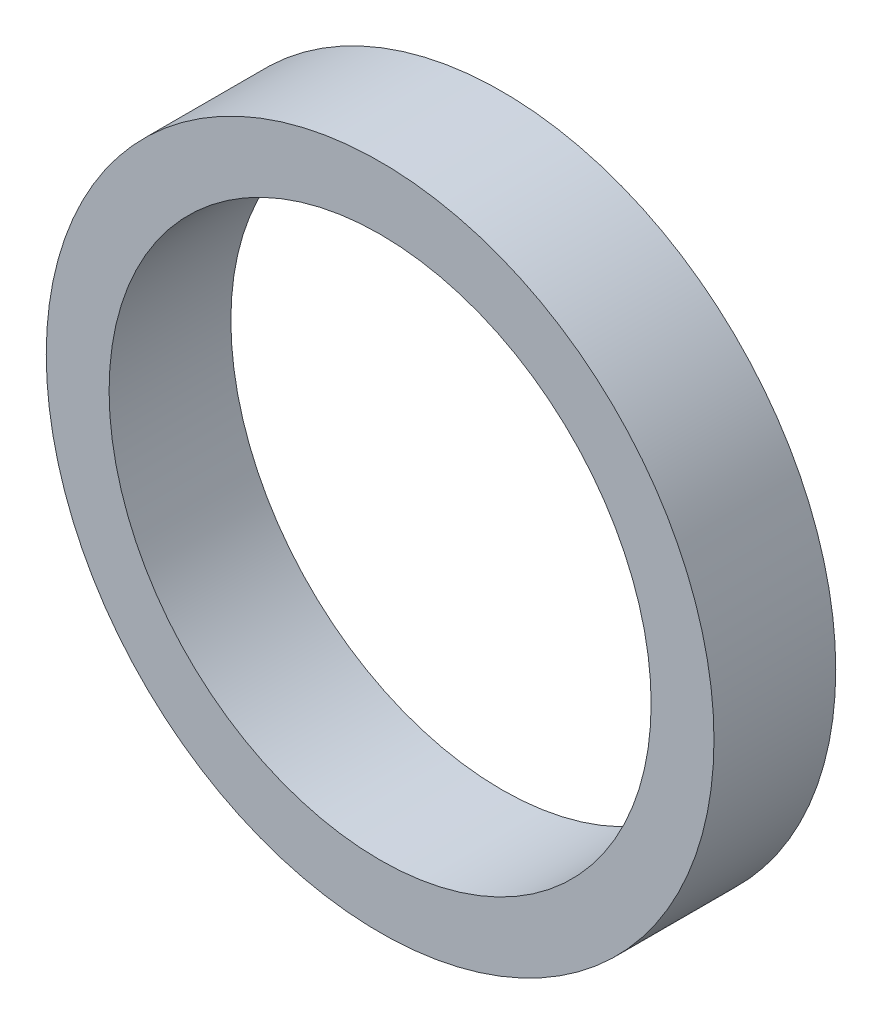
ISO-10303-21;
HEADER;
FILE_DESCRIPTION(('STEP AP214'),'2;1');
FILE_NAME('part.step','',(''),(''),'','','');
FILE_SCHEMA(('AUTOMOTIVE_DESIGN { 1 0 10303 214 1 1 1 1 }'));
ENDSEC;
DATA;
#1=APPLICATION_CONTEXT('core data for automotive mechanical design processes');
#2=APPLICATION_PROTOCOL_DEFINITION('international standard','automotive_design',2000,#1);
#3=PRODUCT_CONTEXT('',#1,'mechanical');
#4=PRODUCT('Part','Part','',(#3));
#5=PRODUCT_RELATED_PRODUCT_CATEGORY('part','',(#4));
#6=PRODUCT_DEFINITION_FORMATION('','',#4);
#7=PRODUCT_DEFINITION_CONTEXT('part definition',#1,'design');
#8=PRODUCT_DEFINITION('design','',#6,#7);
#9=PRODUCT_DEFINITION_SHAPE('','',#8);
#10=(LENGTH_UNIT() NAMED_UNIT(*) SI_UNIT(.MILLI.,.METRE.));
#11=(NAMED_UNIT(*) PLANE_ANGLE_UNIT() SI_UNIT($,.RADIAN.));
#12=(NAMED_UNIT(*) SI_UNIT($,.STERADIAN.) SOLID_ANGLE_UNIT());
#13=UNCERTAINTY_MEASURE_WITH_UNIT(LENGTH_MEASURE(1.E-05),#10,'distance_accuracy_value','');
#14=(GEOMETRIC_REPRESENTATION_CONTEXT(3) GLOBAL_UNCERTAINTY_ASSIGNED_CONTEXT((#13)) GLOBAL_UNIT_ASSIGNED_CONTEXT((#10,
#11,#12)) REPRESENTATION_CONTEXT('',''));
#15=CARTESIAN_POINT('',(0.,0.,0.));
#16=DIRECTION('',(0.,0.,1.));
#17=DIRECTION('',(1.,0.,0.));
#18=AXIS2_PLACEMENT_3D('',#15,#16,#17);
#19=CARTESIAN_POINT('',(0.,0.,6.2));
#20=DIRECTION('',(0.,0.,1.));
#21=DIRECTION('',(1.,0.,0.));
#22=AXIS2_PLACEMENT_3D('',#19,#20,#21);
#23=PLANE('',#22);
#24=CARTESIAN_POINT('',(0.,0.,6.2));
#25=DIRECTION('',(0.,0.,1.));
#26=DIRECTION('',(1.,0.,0.));
#27=AXIS2_PLACEMENT_3D('',#24,#25,#26);
#28=CIRCLE('',#27,17.);
#29=CARTESIAN_POINT('',(-17.,0.,6.2));
#30=VERTEX_POINT('',#29);
#31=EDGE_CURVE('E10',#30,#30,#28,.T.);
#32=ORIENTED_EDGE('',*,*,#31,.T.);
#33=EDGE_LOOP('',(#32));
#34=FACE_BOUND('',#33,.T.);
#35=CARTESIAN_POINT('',(0.,0.,6.2));
#36=DIRECTION('',(0.,0.,1.));
#37=DIRECTION('',(1.,0.,0.));
#38=AXIS2_PLACEMENT_3D('',#35,#36,#37);
#39=CIRCLE('',#38,13.8);
#40=CARTESIAN_POINT('',(-13.8,0.,6.2));
#41=VERTEX_POINT('',#40);
#42=EDGE_CURVE('E42',#41,#41,#39,.T.);
#43=ORIENTED_EDGE('',*,*,#42,.F.);
#44=EDGE_LOOP('',(#43));
#45=FACE_BOUND('',#44,.T.);
#46=ADVANCED_FACE('F31',(#34,#45),#23,.T.);
#47=CARTESIAN_POINT('',(0.,0.,0.));
#48=DIRECTION('',(0.,0.,1.));
#49=DIRECTION('',(1.,0.,0.));
#50=AXIS2_PLACEMENT_3D('',#47,#48,#49);
#51=PLANE('',#50);
#52=CARTESIAN_POINT('',(0.,0.,0.));
#53=DIRECTION('',(0.,0.,1.));
#54=DIRECTION('',(1.,0.,0.));
#55=AXIS2_PLACEMENT_3D('',#52,#53,#54);
#56=CIRCLE('',#55,17.);
#57=CARTESIAN_POINT('',(-17.,0.,0.));
#58=VERTEX_POINT('',#57);
#59=EDGE_CURVE('E35',#58,#58,#56,.T.);
#60=ORIENTED_EDGE('',*,*,#59,.F.);
#61=EDGE_LOOP('',(#60));
#62=FACE_BOUND('',#61,.T.);
#63=CARTESIAN_POINT('',(0.,0.,0.));
#64=DIRECTION('',(0.,0.,1.));
#65=DIRECTION('',(1.,0.,0.));
#66=AXIS2_PLACEMENT_3D('',#63,#64,#65);
#67=CIRCLE('',#66,13.8);
#68=CARTESIAN_POINT('',(-13.8,0.,0.));
#69=VERTEX_POINT('',#68);
#70=EDGE_CURVE('E44',#69,#69,#67,.T.);
#71=ORIENTED_EDGE('',*,*,#70,.T.);
#72=EDGE_LOOP('',(#71));
#73=FACE_BOUND('',#72,.T.);
#74=ADVANCED_FACE('F54',(#62,#73),#51,.F.);
#75=CARTESIAN_POINT('',(0.,0.,6.2));
#76=DIRECTION('',(0.,0.,-1.));
#77=DIRECTION('',(-1.,0.,0.));
#78=AXIS2_PLACEMENT_3D('',#75,#76,#77);
#79=CYLINDRICAL_SURFACE('',#78,17.);
#80=CARTESIAN_POINT('',(-17.,0.,6.2));
#81=CARTESIAN_POINT('',(-17.,0.,6.13541666666667));
#82=CARTESIAN_POINT('',(-17.,0.,6.07083333333333));
#83=CARTESIAN_POINT('',(-17.,0.,5.94166666666667));
#84=CARTESIAN_POINT('',(-17.,0.,5.87708333333333));
#85=CARTESIAN_POINT('',(-17.,0.,5.74791666666667));
#86=CARTESIAN_POINT('',(-17.,0.,5.68333333333333));
#87=CARTESIAN_POINT('',(-17.,0.,5.55416666666667));
#88=CARTESIAN_POINT('',(-17.,0.,5.48958333333333));
#89=CARTESIAN_POINT('',(-17.,0.,5.36041666666667));
#90=CARTESIAN_POINT('',(-17.,0.,5.29583333333333));
#91=CARTESIAN_POINT('',(-17.,0.,5.16666666666667));
#92=CARTESIAN_POINT('',(-17.,0.,5.10208333333333));
#93=CARTESIAN_POINT('',(-17.,0.,4.97291666666667));
#94=CARTESIAN_POINT('',(-17.,0.,4.90833333333333));
#95=CARTESIAN_POINT('',(-17.,0.,4.77916666666667));
#96=CARTESIAN_POINT('',(-17.,0.,4.71458333333333));
#97=CARTESIAN_POINT('',(-17.,0.,4.58541666666667));
#98=CARTESIAN_POINT('',(-17.,0.,4.52083333333333));
#99=CARTESIAN_POINT('',(-17.,0.,4.39166666666667));
#100=CARTESIAN_POINT('',(-17.,0.,4.32708333333333));
#101=CARTESIAN_POINT('',(-17.,0.,4.19791666666667));
#102=CARTESIAN_POINT('',(-17.,0.,4.13333333333333));
#103=CARTESIAN_POINT('',(-17.,0.,4.00416666666667));
#104=CARTESIAN_POINT('',(-17.,0.,3.93958333333333));
#105=CARTESIAN_POINT('',(-17.,0.,3.81041666666667));
#106=CARTESIAN_POINT('',(-17.,0.,3.74583333333333));
#107=CARTESIAN_POINT('',(-17.,0.,3.61666666666667));
#108=CARTESIAN_POINT('',(-17.,0.,3.55208333333333));
#109=CARTESIAN_POINT('',(-17.,0.,3.42291666666667));
#110=CARTESIAN_POINT('',(-17.,0.,3.35833333333333));
#111=CARTESIAN_POINT('',(-17.,0.,3.22916666666667));
#112=CARTESIAN_POINT('',(-17.,0.,3.16458333333333));
#113=CARTESIAN_POINT('',(-17.,0.,3.03541666666667));
#114=CARTESIAN_POINT('',(-17.,0.,2.97083333333333));
#115=CARTESIAN_POINT('',(-17.,0.,2.84166666666667));
#116=CARTESIAN_POINT('',(-17.,0.,2.77708333333333));
#117=CARTESIAN_POINT('',(-17.,0.,2.64791666666667));
#118=CARTESIAN_POINT('',(-17.,0.,2.58333333333333));
#119=CARTESIAN_POINT('',(-17.,0.,2.45416666666667));
#120=CARTESIAN_POINT('',(-17.,0.,2.38958333333333));
#121=CARTESIAN_POINT('',(-17.,0.,2.26041666666667));
#122=CARTESIAN_POINT('',(-17.,0.,2.19583333333333));
#123=CARTESIAN_POINT('',(-17.,0.,2.06666666666667));
#124=CARTESIAN_POINT('',(-17.,0.,2.00208333333333));
#125=CARTESIAN_POINT('',(-17.,0.,1.87291666666667));
#126=CARTESIAN_POINT('',(-17.,0.,1.80833333333333));
#127=CARTESIAN_POINT('',(-17.,0.,1.67916666666667));
#128=CARTESIAN_POINT('',(-17.,0.,1.61458333333333));
#129=CARTESIAN_POINT('',(-17.,0.,1.48541666666667));
#130=CARTESIAN_POINT('',(-17.,0.,1.42083333333333));
#131=CARTESIAN_POINT('',(-17.,0.,1.29166666666667));
#132=CARTESIAN_POINT('',(-17.,0.,1.22708333333333));
#133=CARTESIAN_POINT('',(-17.,0.,1.09791666666667));
#134=CARTESIAN_POINT('',(-17.,0.,1.03333333333333));
#135=CARTESIAN_POINT('',(-17.,0.,0.904166666666667));
#136=CARTESIAN_POINT('',(-17.,0.,0.839583333333333));
#137=CARTESIAN_POINT('',(-17.,0.,0.710416666666666));
#138=CARTESIAN_POINT('',(-17.,0.,0.645833333333333));
#139=CARTESIAN_POINT('',(-17.,0.,0.516666666666667));
#140=CARTESIAN_POINT('',(-17.,0.,0.452083333333333));
#141=CARTESIAN_POINT('',(-17.,0.,0.322916666666667));
#142=CARTESIAN_POINT('',(-17.,0.,0.258333333333334));
#143=CARTESIAN_POINT('',(-17.,0.,0.129166666666667));
#144=CARTESIAN_POINT('',(-17.,0.,0.0645833333333335));
#145=CARTESIAN_POINT('',(-17.,0.,0.));
#146=B_SPLINE_CURVE_WITH_KNOTS('',3,(#80,#81,#82,#83,#84,#85,#86,#87,#88,#89,#90,#91,#92,#93,
#94,#95,#96,#97,#98,#99,#100,#101,#102,#103,#104,#105,#106,#107,#108,#109,#110,#111,#112,#113,
#114,#115,#116,#117,#118,#119,#120,#121,#122,#123,#124,#125,#126,#127,#128,#129,#130,#131,#132,
#133,#134,#135,#136,#137,#138,#139,#140,#141,#142,#143,#144,#145),.UNSPECIFIED.,.F.,.F.,(4,2,2,
2,2,2,2,2,2,2,2,2,2,2,2,2,2,2,2,2,2,2,2,2,2,2,2,2,2,2,2,2,4),(0.,0.19375,0.387500000000001,
0.58125,0.775,0.96875,1.1625,1.35625,1.55,1.74375,1.9375,2.13125,2.325,2.51875,2.7125,2.90625,
3.1,3.29375,3.4875,3.68125,3.875,4.06875,4.2625,4.45625,4.65,4.84375,5.0375,5.23125,5.425,
5.61875,5.8125,6.00625,6.2),.UNSPECIFIED.);
#147=EDGE_CURVE('BSEAM33',#30,#58,#146,.T.);
#148=ORIENTED_EDGE('',*,*,#31,.F.);
#149=ORIENTED_EDGE('',*,*,#59,.T.);
#150=ORIENTED_EDGE('',*,*,#147,.T.);
#151=ORIENTED_EDGE('',*,*,#147,.F.);
#152=EDGE_LOOP('',(#148,#150,#149,#151));
#153=FACE_BOUND('',#152,.T.);
#154=ADVANCED_FACE('F33',(#153),#79,.T.);
#155=CARTESIAN_POINT('',(0.,0.,6.2));
#156=DIRECTION('',(0.,0.,-1.));
#157=DIRECTION('',(-1.,0.,0.));
#158=AXIS2_PLACEMENT_3D('',#155,#156,#157);
#159=CYLINDRICAL_SURFACE('',#158,13.8);
#160=CARTESIAN_POINT('',(-13.8,0.,6.2));
#161=CARTESIAN_POINT('',(-13.8,0.,6.13541666666667));
#162=CARTESIAN_POINT('',(-13.8,0.,6.07083333333333));
#163=CARTESIAN_POINT('',(-13.8,0.,5.94166666666667));
#164=CARTESIAN_POINT('',(-13.8,0.,5.87708333333333));
#165=CARTESIAN_POINT('',(-13.8,0.,5.74791666666667));
#166=CARTESIAN_POINT('',(-13.8,0.,5.68333333333333));
#167=CARTESIAN_POINT('',(-13.8,0.,5.55416666666667));
#168=CARTESIAN_POINT('',(-13.8,0.,5.48958333333333));
#169=CARTESIAN_POINT('',(-13.8,0.,5.36041666666667));
#170=CARTESIAN_POINT('',(-13.8,0.,5.29583333333333));
#171=CARTESIAN_POINT('',(-13.8,0.,5.16666666666667));
#172=CARTESIAN_POINT('',(-13.8,0.,5.10208333333333));
#173=CARTESIAN_POINT('',(-13.8,0.,4.97291666666667));
#174=CARTESIAN_POINT('',(-13.8,0.,4.90833333333333));
#175=CARTESIAN_POINT('',(-13.8,0.,4.77916666666667));
#176=CARTESIAN_POINT('',(-13.8,0.,4.71458333333333));
#177=CARTESIAN_POINT('',(-13.8,0.,4.58541666666667));
#178=CARTESIAN_POINT('',(-13.8,0.,4.52083333333333));
#179=CARTESIAN_POINT('',(-13.8,0.,4.39166666666667));
#180=CARTESIAN_POINT('',(-13.8,0.,4.32708333333333));
#181=CARTESIAN_POINT('',(-13.8,0.,4.19791666666667));
#182=CARTESIAN_POINT('',(-13.8,0.,4.13333333333333));
#183=CARTESIAN_POINT('',(-13.8,0.,4.00416666666667));
#184=CARTESIAN_POINT('',(-13.8,0.,3.93958333333333));
#185=CARTESIAN_POINT('',(-13.8,0.,3.81041666666667));
#186=CARTESIAN_POINT('',(-13.8,0.,3.74583333333333));
#187=CARTESIAN_POINT('',(-13.8,0.,3.61666666666667));
#188=CARTESIAN_POINT('',(-13.8,0.,3.55208333333333));
#189=CARTESIAN_POINT('',(-13.8,0.,3.42291666666667));
#190=CARTESIAN_POINT('',(-13.8,0.,3.35833333333333));
#191=CARTESIAN_POINT('',(-13.8,0.,3.22916666666667));
#192=CARTESIAN_POINT('',(-13.8,0.,3.16458333333333));
#193=CARTESIAN_POINT('',(-13.8,0.,3.03541666666667));
#194=CARTESIAN_POINT('',(-13.8,0.,2.97083333333333));
#195=CARTESIAN_POINT('',(-13.8,0.,2.84166666666667));
#196=CARTESIAN_POINT('',(-13.8,0.,2.77708333333333));
#197=CARTESIAN_POINT('',(-13.8,0.,2.64791666666667));
#198=CARTESIAN_POINT('',(-13.8,0.,2.58333333333333));
#199=CARTESIAN_POINT('',(-13.8,0.,2.45416666666667));
#200=CARTESIAN_POINT('',(-13.8,0.,2.38958333333333));
#201=CARTESIAN_POINT('',(-13.8,0.,2.26041666666667));
#202=CARTESIAN_POINT('',(-13.8,0.,2.19583333333333));
#203=CARTESIAN_POINT('',(-13.8,0.,2.06666666666667));
#204=CARTESIAN_POINT('',(-13.8,0.,2.00208333333333));
#205=CARTESIAN_POINT('',(-13.8,0.,1.87291666666667));
#206=CARTESIAN_POINT('',(-13.8,0.,1.80833333333333));
#207=CARTESIAN_POINT('',(-13.8,0.,1.67916666666667));
#208=CARTESIAN_POINT('',(-13.8,0.,1.61458333333333));
#209=CARTESIAN_POINT('',(-13.8,0.,1.48541666666667));
#210=CARTESIAN_POINT('',(-13.8,0.,1.42083333333333));
#211=CARTESIAN_POINT('',(-13.8,0.,1.29166666666667));
#212=CARTESIAN_POINT('',(-13.8,0.,1.22708333333333));
#213=CARTESIAN_POINT('',(-13.8,0.,1.09791666666667));
#214=CARTESIAN_POINT('',(-13.8,0.,1.03333333333333));
#215=CARTESIAN_POINT('',(-13.8,0.,0.904166666666667));
#216=CARTESIAN_POINT('',(-13.8,0.,0.839583333333333));
#217=CARTESIAN_POINT('',(-13.8,0.,0.710416666666666));
#218=CARTESIAN_POINT('',(-13.8,0.,0.645833333333333));
#219=CARTESIAN_POINT('',(-13.8,0.,0.516666666666667));
#220=CARTESIAN_POINT('',(-13.8,0.,0.452083333333333));
#221=CARTESIAN_POINT('',(-13.8,0.,0.322916666666667));
#222=CARTESIAN_POINT('',(-13.8,0.,0.258333333333334));
#223=CARTESIAN_POINT('',(-13.8,0.,0.129166666666667));
#224=CARTESIAN_POINT('',(-13.8,0.,0.0645833333333335));
#225=CARTESIAN_POINT('',(-13.8,0.,0.));
#226=B_SPLINE_CURVE_WITH_KNOTS('',3,(#160,#161,#162,#163,#164,#165,#166,#167,#168,#169,#170,
#171,#172,#173,#174,#175,#176,#177,#178,#179,#180,#181,#182,#183,#184,#185,#186,#187,#188,#189,
#190,#191,#192,#193,#194,#195,#196,#197,#198,#199,#200,#201,#202,#203,#204,#205,#206,#207,#208,
#209,#210,#211,#212,#213,#214,#215,#216,#217,#218,#219,#220,#221,#222,#223,#224,#225),
.UNSPECIFIED.,.F.,.F.,(4,2,2,2,2,2,2,2,2,2,2,2,2,2,2,2,2,2,2,2,2,2,2,2,2,2,2,2,2,2,2,2,4),(0.,
0.193749999999999,0.3875,0.581249999999999,0.775,0.968749999999999,1.1625,1.35625,1.55,1.74375,
1.9375,2.13125,2.325,2.51875,2.7125,2.90625,3.1,3.29375,3.4875,3.68125,3.875,4.06875,4.2625,
4.45625,4.65,4.84375,5.0375,5.23125,5.425,5.61875,5.8125,6.00625,6.2),.UNSPECIFIED.);
#227=EDGE_CURVE('BSEAM50',#41,#69,#226,.T.);
#228=ORIENTED_EDGE('',*,*,#42,.T.);
#229=ORIENTED_EDGE('',*,*,#70,.F.);
#230=ORIENTED_EDGE('',*,*,#227,.T.);
#231=ORIENTED_EDGE('',*,*,#227,.F.);
#232=EDGE_LOOP('',(#228,#230,#229,#231));
#233=FACE_BOUND('',#232,.T.);
#234=ADVANCED_FACE('F50',(#233),#159,.F.);
#235=CLOSED_SHELL('',(#46,#74,#154,#234));
#236=MANIFOLD_SOLID_BREP('B2',#235);
#237=ADVANCED_BREP_SHAPE_REPRESENTATION('',(#18,#236),#14);
#238=SHAPE_DEFINITION_REPRESENTATION(#9,#237);
ENDSEC;
END-ISO-10303-21;
